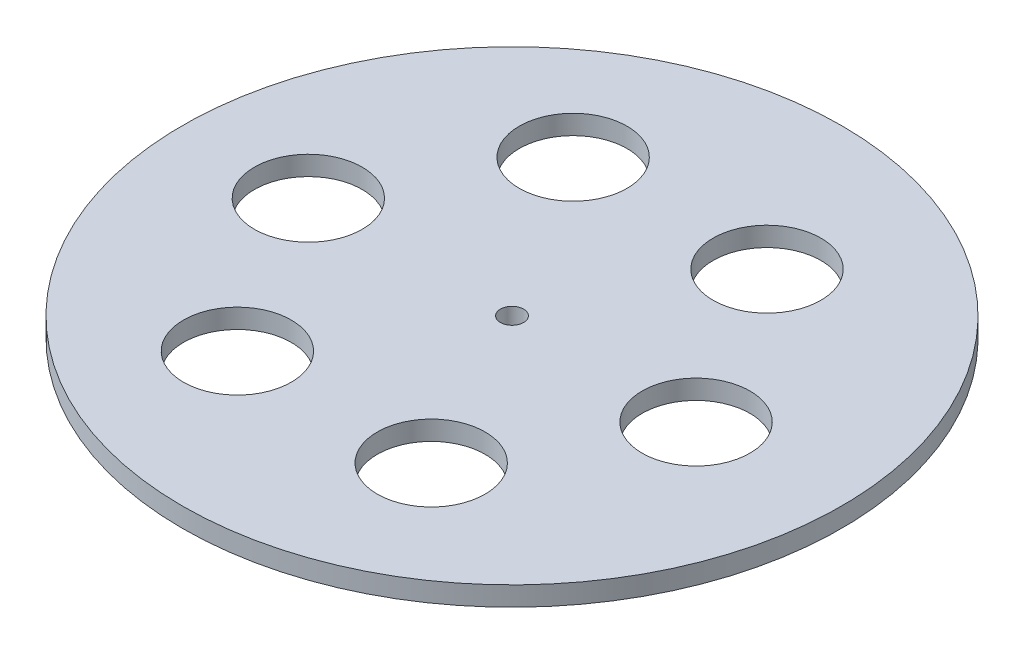
ISO-10303-21;
HEADER;
FILE_DESCRIPTION(('STEP AP214'),'2;1');
FILE_NAME('part.step','',(''),(''),'','','');
FILE_SCHEMA(('AUTOMOTIVE_DESIGN { 1 0 10303 214 1 1 1 1 }'));
ENDSEC;
DATA;
#1=APPLICATION_CONTEXT('core data for automotive mechanical design processes');
#2=APPLICATION_PROTOCOL_DEFINITION('international standard','automotive_design',2000,#1);
#3=PRODUCT_CONTEXT('',#1,'mechanical');
#4=PRODUCT('Part','Part','',(#3));
#5=PRODUCT_RELATED_PRODUCT_CATEGORY('part','',(#4));
#6=PRODUCT_DEFINITION_FORMATION('','',#4);
#7=PRODUCT_DEFINITION_CONTEXT('part definition',#1,'design');
#8=PRODUCT_DEFINITION('design','',#6,#7);
#9=PRODUCT_DEFINITION_SHAPE('','',#8);
#10=(LENGTH_UNIT() NAMED_UNIT(*) SI_UNIT(.MILLI.,.METRE.));
#11=(NAMED_UNIT(*) PLANE_ANGLE_UNIT() SI_UNIT($,.RADIAN.));
#12=(NAMED_UNIT(*) SI_UNIT($,.STERADIAN.) SOLID_ANGLE_UNIT());
#13=UNCERTAINTY_MEASURE_WITH_UNIT(LENGTH_MEASURE(1.E-05),#10,'distance_accuracy_value','');
#14=(GEOMETRIC_REPRESENTATION_CONTEXT(3) GLOBAL_UNCERTAINTY_ASSIGNED_CONTEXT((#13)) GLOBAL_UNIT_ASSIGNED_CONTEXT((#10,
#11,#12)) REPRESENTATION_CONTEXT('',''));
#15=CARTESIAN_POINT('',(0.,0.,0.));
#16=DIRECTION('',(0.,0.,1.));
#17=DIRECTION('',(1.,0.,0.));
#18=AXIS2_PLACEMENT_3D('',#15,#16,#17);
#19=CARTESIAN_POINT('',(0.,5.,0.));
#20=DIRECTION('',(0.,-1.,0.));
#21=DIRECTION('',(0.,0.,-1.));
#22=AXIS2_PLACEMENT_3D('',#19,#20,#21);
#23=CYLINDRICAL_SURFACE('',#22,85.);
#24=CARTESIAN_POINT('',(0.,5.,0.));
#25=DIRECTION('',(0.,1.,0.));
#26=DIRECTION('',(0.,0.,1.));
#27=AXIS2_PLACEMENT_3D('',#24,#25,#26);
#28=CIRCLE('',#27,85.);
#29=CARTESIAN_POINT('',(0.,5.,85.));
#30=VERTEX_POINT('',#29);
#31=EDGE_CURVE('E10',#30,#30,#28,.T.);
#32=ORIENTED_EDGE('',*,*,#31,.F.);
#33=EDGE_LOOP('',(#32));
#34=FACE_BOUND('',#33,.T.);
#35=CARTESIAN_POINT('',(0.,0.,0.));
#36=DIRECTION('',(0.,1.,0.));
#37=DIRECTION('',(0.,0.,1.));
#38=AXIS2_PLACEMENT_3D('',#35,#36,#37);
#39=CIRCLE('',#38,85.);
#40=CARTESIAN_POINT('',(0.,0.,85.));
#41=VERTEX_POINT('',#40);
#42=EDGE_CURVE('E40',#41,#41,#39,.T.);
#43=ORIENTED_EDGE('',*,*,#42,.T.);
#44=EDGE_LOOP('',(#43));
#45=FACE_BOUND('',#44,.T.);
#46=ADVANCED_FACE('F33',(#34,#45),#23,.T.);
#47=CARTESIAN_POINT('',(0.,5.,0.));
#48=DIRECTION('',(0.,1.,0.));
#49=DIRECTION('',(0.,0.,1.));
#50=AXIS2_PLACEMENT_3D('',#47,#48,#49);
#51=PLANE('',#50);
#52=CARTESIAN_POINT('',(0.,5.,0.));
#53=DIRECTION('',(0.,1.,0.));
#54=DIRECTION('',(0.,0.,1.));
#55=AXIS2_PLACEMENT_3D('',#52,#53,#54);
#56=CIRCLE('',#55,3.);
#57=CARTESIAN_POINT('',(0.,5.,3.));
#58=VERTEX_POINT('',#57);
#59=EDGE_CURVE('E82',#58,#58,#56,.T.);
#60=ORIENTED_EDGE('',*,*,#59,.F.);
#61=EDGE_LOOP('',(#60));
#62=FACE_BOUND('',#61,.T.);
#63=CARTESIAN_POINT('',(22.4689046055376,5.,43.301270189222));
#64=DIRECTION('',(0.,1.,0.));
#65=DIRECTION('',(0.,0.,1.));
#66=AXIS2_PLACEMENT_3D('',#63,#64,#65);
#67=CIRCLE('',#66,13.9011205530533);
#68=CARTESIAN_POINT('',(22.4689046055376,5.,57.2023907422752));
#69=VERTEX_POINT('',#68);
#70=EDGE_CURVE('E72',#69,#69,#67,.T.);
#71=ORIENTED_EDGE('',*,*,#70,.F.);
#72=EDGE_LOOP('',(#71));
#73=FACE_BOUND('',#72,.T.);
#74=CARTESIAN_POINT('',(-27.5310953944625,5.,43.3012701892218));
#75=DIRECTION('',(0.,1.,0.));
#76=DIRECTION('',(0.,0.,1.));
#77=AXIS2_PLACEMENT_3D('',#74,#75,#76);
#78=CIRCLE('',#77,13.9011205530533);
#79=CARTESIAN_POINT('',(-27.5310953944625,5.,57.2023907422751));
#80=VERTEX_POINT('',#79);
#81=EDGE_CURVE('E66',#80,#80,#78,.T.);
#82=ORIENTED_EDGE('',*,*,#81,.F.);
#83=EDGE_LOOP('',(#82));
#84=FACE_BOUND('',#83,.T.);
#85=CARTESIAN_POINT('',(-52.5310953944623,5.,-3.61394601875787E-13));
#86=DIRECTION('',(0.,1.,0.));
#87=DIRECTION('',(0.,0.,1.));
#88=AXIS2_PLACEMENT_3D('',#85,#86,#87);
#89=CIRCLE('',#88,13.9011205530533);
#90=CARTESIAN_POINT('',(-52.5310953944623,5.,13.9011205530529));
#91=VERTEX_POINT('',#90);
#92=EDGE_CURVE('E60',#91,#91,#89,.T.);
#93=ORIENTED_EDGE('',*,*,#92,.F.);
#94=EDGE_LOOP('',(#93));
#95=FACE_BOUND('',#94,.T.);
#96=CARTESIAN_POINT('',(-27.5310953944619,5.,-43.3012701892222));
#97=DIRECTION('',(0.,1.,0.));
#98=DIRECTION('',(0.,0.,1.));
#99=AXIS2_PLACEMENT_3D('',#96,#97,#98);
#100=CIRCLE('',#99,13.9011205530533);
#101=CARTESIAN_POINT('',(-27.5310953944619,5.,-29.4001496361689));
#102=VERTEX_POINT('',#101);
#103=EDGE_CURVE('E53',#102,#102,#100,.T.);
#104=ORIENTED_EDGE('',*,*,#103,.F.);
#105=EDGE_LOOP('',(#104));
#106=FACE_BOUND('',#105,.T.);
#107=CARTESIAN_POINT('',(22.4689046055382,5.,-43.3012701892216));
#108=DIRECTION('',(0.,1.,0.));
#109=DIRECTION('',(0.,0.,1.));
#110=AXIS2_PLACEMENT_3D('',#107,#108,#109);
#111=CIRCLE('',#110,13.9011205530533);
#112=CARTESIAN_POINT('',(22.4689046055382,5.,-29.4001496361684));
#113=VERTEX_POINT('',#112);
#114=EDGE_CURVE('E77',#113,#113,#111,.T.);
#115=ORIENTED_EDGE('',*,*,#114,.F.);
#116=EDGE_LOOP('',(#115));
#117=FACE_BOUND('',#116,.T.);
#118=CARTESIAN_POINT('',(47.4689046055377,5.,0.));
#119=DIRECTION('',(0.,1.,0.));
#120=DIRECTION('',(0.,0.,1.));
#121=AXIS2_PLACEMENT_3D('',#118,#119,#120);
#122=CIRCLE('',#121,13.9011205530533);
#123=CARTESIAN_POINT('',(47.4689046055377,5.,13.9011205530533));
#124=VERTEX_POINT('',#123);
#125=EDGE_CURVE('E47',#124,#124,#122,.T.);
#126=ORIENTED_EDGE('',*,*,#125,.F.);
#127=EDGE_LOOP('',(#126));
#128=FACE_BOUND('',#127,.T.);
#129=ORIENTED_EDGE('',*,*,#31,.T.);
#130=EDGE_LOOP('',(#129));
#131=FACE_BOUND('',#130,.T.);
#132=ADVANCED_FACE('F105',(#62,#73,#84,#95,#106,#117,#128,#131),#51,.T.);
#133=CARTESIAN_POINT('',(0.,0.,0.));
#134=DIRECTION('',(0.,1.,0.));
#135=DIRECTION('',(0.,0.,1.));
#136=AXIS2_PLACEMENT_3D('',#133,#134,#135);
#137=PLANE('',#136);
#138=CARTESIAN_POINT('',(0.,0.,0.));
#139=DIRECTION('',(0.,1.,0.));
#140=DIRECTION('',(0.,0.,1.));
#141=AXIS2_PLACEMENT_3D('',#138,#139,#140);
#142=CIRCLE('',#141,3.);
#143=CARTESIAN_POINT('',(0.,0.,3.));
#144=VERTEX_POINT('',#143);
#145=EDGE_CURVE('E36',#144,#144,#142,.T.);
#146=ORIENTED_EDGE('',*,*,#145,.T.);
#147=EDGE_LOOP('',(#146));
#148=FACE_BOUND('',#147,.T.);
#149=CARTESIAN_POINT('',(22.4689046055376,0.,43.301270189222));
#150=DIRECTION('',(0.,1.,0.));
#151=DIRECTION('',(0.,0.,1.));
#152=AXIS2_PLACEMENT_3D('',#149,#150,#151);
#153=CIRCLE('',#152,13.9011205530533);
#154=CARTESIAN_POINT('',(22.4689046055376,0.,57.2023907422752));
#155=VERTEX_POINT('',#154);
#156=EDGE_CURVE('E50',#155,#155,#153,.T.);
#157=ORIENTED_EDGE('',*,*,#156,.T.);
#158=EDGE_LOOP('',(#157));
#159=FACE_BOUND('',#158,.T.);
#160=CARTESIAN_POINT('',(-27.5310953944625,0.,43.3012701892218));
#161=DIRECTION('',(0.,1.,0.));
#162=DIRECTION('',(0.,0.,1.));
#163=AXIS2_PLACEMENT_3D('',#160,#161,#162);
#164=CIRCLE('',#163,13.9011205530533);
#165=CARTESIAN_POINT('',(-27.5310953944625,0.,57.2023907422751));
#166=VERTEX_POINT('',#165);
#167=EDGE_CURVE('E69',#166,#166,#164,.T.);
#168=ORIENTED_EDGE('',*,*,#167,.T.);
#169=EDGE_LOOP('',(#168));
#170=FACE_BOUND('',#169,.T.);
#171=CARTESIAN_POINT('',(-52.5310953944623,0.,-3.61394601875787E-13));
#172=DIRECTION('',(0.,1.,0.));
#173=DIRECTION('',(0.,0.,1.));
#174=AXIS2_PLACEMENT_3D('',#171,#172,#173);
#175=CIRCLE('',#174,13.9011205530533);
#176=CARTESIAN_POINT('',(-52.5310953944623,0.,13.9011205530529));
#177=VERTEX_POINT('',#176);
#178=EDGE_CURVE('E63',#177,#177,#175,.T.);
#179=ORIENTED_EDGE('',*,*,#178,.T.);
#180=EDGE_LOOP('',(#179));
#181=FACE_BOUND('',#180,.T.);
#182=CARTESIAN_POINT('',(-27.5310953944619,0.,-43.3012701892222));
#183=DIRECTION('',(0.,1.,0.));
#184=DIRECTION('',(0.,0.,1.));
#185=AXIS2_PLACEMENT_3D('',#182,#183,#184);
#186=CIRCLE('',#185,13.9011205530533);
#187=CARTESIAN_POINT('',(-27.5310953944619,0.,-29.4001496361689));
#188=VERTEX_POINT('',#187);
#189=EDGE_CURVE('E56',#188,#188,#186,.T.);
#190=ORIENTED_EDGE('',*,*,#189,.T.);
#191=EDGE_LOOP('',(#190));
#192=FACE_BOUND('',#191,.T.);
#193=CARTESIAN_POINT('',(22.4689046055382,0.,-43.3012701892216));
#194=DIRECTION('',(0.,1.,0.));
#195=DIRECTION('',(0.,0.,1.));
#196=AXIS2_PLACEMENT_3D('',#193,#194,#195);
#197=CIRCLE('',#196,13.9011205530533);
#198=CARTESIAN_POINT('',(22.4689046055382,0.,-29.4001496361684));
#199=VERTEX_POINT('',#198);
#200=EDGE_CURVE('E57',#199,#199,#197,.T.);
#201=ORIENTED_EDGE('',*,*,#200,.T.);
#202=EDGE_LOOP('',(#201));
#203=FACE_BOUND('',#202,.T.);
#204=CARTESIAN_POINT('',(47.4689046055377,0.,0.));
#205=DIRECTION('',(0.,1.,0.));
#206=DIRECTION('',(0.,0.,1.));
#207=AXIS2_PLACEMENT_3D('',#204,#205,#206);
#208=CIRCLE('',#207,13.9011205530533);
#209=CARTESIAN_POINT('',(47.4689046055377,0.,13.9011205530533));
#210=VERTEX_POINT('',#209);
#211=EDGE_CURVE('E45',#210,#210,#208,.T.);
#212=ORIENTED_EDGE('',*,*,#211,.T.);
#213=EDGE_LOOP('',(#212));
#214=FACE_BOUND('',#213,.T.);
#215=ORIENTED_EDGE('',*,*,#42,.F.);
#216=EDGE_LOOP('',(#215));
#217=FACE_BOUND('',#216,.T.);
#218=ADVANCED_FACE('F89',(#148,#159,#170,#181,#192,#203,#214,#217),#137,.F.);
#219=CARTESIAN_POINT('',(47.4689046055377,0.,0.));
#220=DIRECTION('',(0.,1.,0.));
#221=DIRECTION('',(0.,0.,1.));
#222=AXIS2_PLACEMENT_3D('',#219,#220,#221);
#223=CYLINDRICAL_SURFACE('',#222,13.9011205530533);
#224=ORIENTED_EDGE('',*,*,#211,.F.);
#225=EDGE_LOOP('',(#224));
#226=FACE_BOUND('',#225,.T.);
#227=ORIENTED_EDGE('',*,*,#125,.T.);
#228=EDGE_LOOP('',(#227));
#229=FACE_BOUND('',#228,.T.);
#230=ADVANCED_FACE('F117',(#226,#229),#223,.F.);
#231=CARTESIAN_POINT('',(22.4689046055382,0.,-43.3012701892216));
#232=DIRECTION('',(0.,1.,0.));
#233=DIRECTION('',(0.,0.,1.));
#234=AXIS2_PLACEMENT_3D('',#231,#232,#233);
#235=CYLINDRICAL_SURFACE('',#234,13.9011205530533);
#236=ORIENTED_EDGE('',*,*,#200,.F.);
#237=EDGE_LOOP('',(#236));
#238=FACE_BOUND('',#237,.T.);
#239=ORIENTED_EDGE('',*,*,#114,.T.);
#240=EDGE_LOOP('',(#239));
#241=FACE_BOUND('',#240,.T.);
#242=ADVANCED_FACE('F121',(#238,#241),#235,.F.);
#243=CARTESIAN_POINT('',(-27.5310953944619,0.,-43.3012701892222));
#244=DIRECTION('',(0.,1.,0.));
#245=DIRECTION('',(0.,0.,1.));
#246=AXIS2_PLACEMENT_3D('',#243,#244,#245);
#247=CYLINDRICAL_SURFACE('',#246,13.9011205530533);
#248=ORIENTED_EDGE('',*,*,#189,.F.);
#249=EDGE_LOOP('',(#248));
#250=FACE_BOUND('',#249,.T.);
#251=ORIENTED_EDGE('',*,*,#103,.T.);
#252=EDGE_LOOP('',(#251));
#253=FACE_BOUND('',#252,.T.);
#254=ADVANCED_FACE('F125',(#250,#253),#247,.F.);
#255=CARTESIAN_POINT('',(-52.5310953944623,0.,-3.61394601875787E-13));
#256=DIRECTION('',(0.,1.,0.));
#257=DIRECTION('',(0.,0.,1.));
#258=AXIS2_PLACEMENT_3D('',#255,#256,#257);
#259=CYLINDRICAL_SURFACE('',#258,13.9011205530533);
#260=ORIENTED_EDGE('',*,*,#178,.F.);
#261=EDGE_LOOP('',(#260));
#262=FACE_BOUND('',#261,.T.);
#263=ORIENTED_EDGE('',*,*,#92,.T.);
#264=EDGE_LOOP('',(#263));
#265=FACE_BOUND('',#264,.T.);
#266=ADVANCED_FACE('F128',(#262,#265),#259,.F.);
#267=CARTESIAN_POINT('',(-27.5310953944625,0.,43.3012701892218));
#268=DIRECTION('',(0.,1.,0.));
#269=DIRECTION('',(0.,0.,1.));
#270=AXIS2_PLACEMENT_3D('',#267,#268,#269);
#271=CYLINDRICAL_SURFACE('',#270,13.9011205530533);
#272=ORIENTED_EDGE('',*,*,#167,.F.);
#273=EDGE_LOOP('',(#272));
#274=FACE_BOUND('',#273,.T.);
#275=ORIENTED_EDGE('',*,*,#81,.T.);
#276=EDGE_LOOP('',(#275));
#277=FACE_BOUND('',#276,.T.);
#278=ADVANCED_FACE('F100',(#274,#277),#271,.F.);
#279=CARTESIAN_POINT('',(22.4689046055376,0.,43.301270189222));
#280=DIRECTION('',(0.,1.,0.));
#281=DIRECTION('',(0.,0.,1.));
#282=AXIS2_PLACEMENT_3D('',#279,#280,#281);
#283=CYLINDRICAL_SURFACE('',#282,13.9011205530533);
#284=ORIENTED_EDGE('',*,*,#156,.F.);
#285=EDGE_LOOP('',(#284));
#286=FACE_BOUND('',#285,.T.);
#287=ORIENTED_EDGE('',*,*,#70,.T.);
#288=EDGE_LOOP('',(#287));
#289=FACE_BOUND('',#288,.T.);
#290=ADVANCED_FACE('F94',(#286,#289),#283,.F.);
#291=CARTESIAN_POINT('',(0.,-5.,0.));
#292=DIRECTION('',(0.,1.,0.));
#293=DIRECTION('',(0.,0.,1.));
#294=AXIS2_PLACEMENT_3D('',#291,#292,#293);
#295=CYLINDRICAL_SURFACE('',#294,3.);
#296=ORIENTED_EDGE('',*,*,#59,.T.);
#297=EDGE_LOOP('',(#296));
#298=FACE_BOUND('',#297,.T.);
#299=ORIENTED_EDGE('',*,*,#145,.F.);
#300=EDGE_LOOP('',(#299));
#301=FACE_BOUND('',#300,.T.);
#302=ADVANCED_FACE('F92',(#298,#301),#295,.F.);
#303=CLOSED_SHELL('',(#46,#132,#218,#230,#242,#254,#266,#278,#290,#302));
#304=MANIFOLD_SOLID_BREP('B2',#303);
#305=ADVANCED_BREP_SHAPE_REPRESENTATION('',(#18,#304),#14);
#306=SHAPE_DEFINITION_REPRESENTATION(#9,#305);
ENDSEC;
END-ISO-10303-21;
